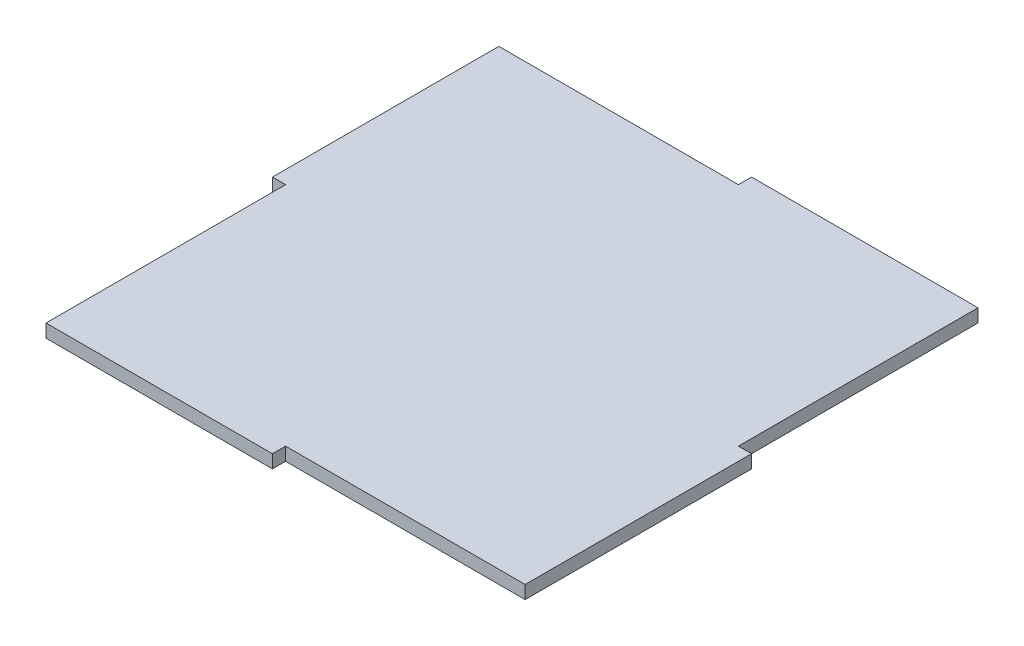
ISO-10303-21;
HEADER;
FILE_DESCRIPTION(('STEP AP214'),'2;1');
FILE_NAME('part.step','',(''),(''),'','','');
FILE_SCHEMA(('AUTOMOTIVE_DESIGN { 1 0 10303 214 1 1 1 1 }'));
ENDSEC;
DATA;
#1=APPLICATION_CONTEXT('core data for automotive mechanical design processes');
#2=APPLICATION_PROTOCOL_DEFINITION('international standard','automotive_design',2000,#1);
#3=PRODUCT_CONTEXT('',#1,'mechanical');
#4=PRODUCT('Part','Part','',(#3));
#5=PRODUCT_RELATED_PRODUCT_CATEGORY('part','',(#4));
#6=PRODUCT_DEFINITION_FORMATION('','',#4);
#7=PRODUCT_DEFINITION_CONTEXT('part definition',#1,'design');
#8=PRODUCT_DEFINITION('design','',#6,#7);
#9=PRODUCT_DEFINITION_SHAPE('','',#8);
#10=(LENGTH_UNIT() NAMED_UNIT(*) SI_UNIT(.MILLI.,.METRE.));
#11=(NAMED_UNIT(*) PLANE_ANGLE_UNIT() SI_UNIT($,.RADIAN.));
#12=(NAMED_UNIT(*) SI_UNIT($,.STERADIAN.) SOLID_ANGLE_UNIT());
#13=UNCERTAINTY_MEASURE_WITH_UNIT(LENGTH_MEASURE(1.E-05),#10,'distance_accuracy_value','');
#14=(GEOMETRIC_REPRESENTATION_CONTEXT(3) GLOBAL_UNCERTAINTY_ASSIGNED_CONTEXT((#13)) GLOBAL_UNIT_ASSIGNED_CONTEXT((#10,
#11,#12)) REPRESENTATION_CONTEXT('',''));
#15=CARTESIAN_POINT('',(0.,0.,0.));
#16=DIRECTION('',(0.,0.,1.));
#17=DIRECTION('',(1.,0.,0.));
#18=AXIS2_PLACEMENT_3D('',#15,#16,#17);
#19=CARTESIAN_POINT('',(41.3000000000002,2.4,-1.19406799263071E-13));
#20=DIRECTION('',(1.,0.,0.));
#21=DIRECTION('',(0.,0.,-1.));
#22=AXIS2_PLACEMENT_3D('',#19,#20,#21);
#23=PLANE('',#22);
#24=DIRECTION('',(0.,0.,1.));
#25=VECTOR('',#24,1.);
#26=CARTESIAN_POINT('',(41.3000000000002,0.,-1.19406799263071E-13));
#27=LINE('',#26,#25);
#28=CARTESIAN_POINT('',(41.3,0.,-87.4));
#29=VERTEX_POINT('',#28);
#30=CARTESIAN_POINT('',(41.3,0.,-85.));
#31=VERTEX_POINT('',#30);
#32=EDGE_CURVE('E155',#29,#31,#27,.T.);
#33=ORIENTED_EDGE('',*,*,#32,.T.);
#34=DIRECTION('',(0.,-1.,0.));
#35=VECTOR('',#34,1.);
#36=CARTESIAN_POINT('',(41.3,2.4,-85.));
#37=LINE('',#36,#35);
#38=CARTESIAN_POINT('',(41.3,2.4,-85.));
#39=VERTEX_POINT('',#38);
#40=EDGE_CURVE('E11',#39,#31,#37,.T.);
#41=ORIENTED_EDGE('',*,*,#40,.F.);
#42=DIRECTION('',(0.,0.,1.));
#43=VECTOR('',#42,1.);
#44=CARTESIAN_POINT('',(41.3000000000002,2.4,-1.19406799263071E-13));
#45=LINE('',#44,#43);
#46=CARTESIAN_POINT('',(41.3,2.4,-87.4));
#47=VERTEX_POINT('',#46);
#48=EDGE_CURVE('E181',#47,#39,#45,.T.);
#49=ORIENTED_EDGE('',*,*,#48,.F.);
#50=DIRECTION('',(0.,-1.,0.));
#51=VECTOR('',#50,1.);
#52=CARTESIAN_POINT('',(41.3,2.4,-87.4));
#53=LINE('',#52,#51);
#54=EDGE_CURVE('E51',#47,#29,#53,.T.);
#55=ORIENTED_EDGE('',*,*,#54,.T.);
#56=EDGE_LOOP('',(#33,#41,#49,#55));
#57=FACE_BOUND('',#56,.T.);
#58=ADVANCED_FACE('F35',(#57),#23,.F.);
#59=CARTESIAN_POINT('',(0.,2.4,-85.));
#60=DIRECTION('',(0.,0.,1.));
#61=DIRECTION('',(1.,0.,0.));
#62=AXIS2_PLACEMENT_3D('',#59,#60,#61);
#63=PLANE('',#62);
#64=DIRECTION('',(-1.,0.,0.));
#65=VECTOR('',#64,1.);
#66=CARTESIAN_POINT('',(0.,0.,-85.));
#67=LINE('',#66,#65);
#68=CARTESIAN_POINT('',(-2.40000000000001,0.,-85.));
#69=VERTEX_POINT('',#68);
#70=EDGE_CURVE('E157',#31,#69,#67,.T.);
#71=ORIENTED_EDGE('',*,*,#70,.T.);
#72=DIRECTION('',(0.,-1.,0.));
#73=VECTOR('',#72,1.);
#74=CARTESIAN_POINT('',(-2.40000000000001,2.4,-85.));
#75=LINE('',#74,#73);
#76=CARTESIAN_POINT('',(-2.40000000000001,2.4,-85.));
#77=VERTEX_POINT('',#76);
#78=EDGE_CURVE('E43',#77,#69,#75,.T.);
#79=ORIENTED_EDGE('',*,*,#78,.F.);
#80=DIRECTION('',(-1.,0.,0.));
#81=VECTOR('',#80,1.);
#82=CARTESIAN_POINT('',(0.,2.4,-85.));
#83=LINE('',#82,#81);
#84=EDGE_CURVE('E102',#39,#77,#83,.T.);
#85=ORIENTED_EDGE('',*,*,#84,.F.);
#86=ORIENTED_EDGE('',*,*,#40,.T.);
#87=EDGE_LOOP('',(#71,#79,#85,#86));
#88=FACE_BOUND('',#87,.T.);
#89=ADVANCED_FACE('F249',(#88),#63,.F.);
#90=CARTESIAN_POINT('',(-2.39999999999999,2.4,0.));
#91=DIRECTION('',(1.,0.,0.));
#92=DIRECTION('',(0.,0.,-1.));
#93=AXIS2_PLACEMENT_3D('',#90,#91,#92);
#94=PLANE('',#93);
#95=DIRECTION('',(0.,0.,1.));
#96=VECTOR('',#95,1.);
#97=CARTESIAN_POINT('',(-2.39999999999999,0.,0.));
#98=LINE('',#97,#96);
#99=CARTESIAN_POINT('',(-2.4,0.,-43.7));
#100=VERTEX_POINT('',#99);
#101=EDGE_CURVE('E159',#69,#100,#98,.T.);
#102=ORIENTED_EDGE('',*,*,#101,.T.);
#103=DIRECTION('',(0.,-1.,0.));
#104=VECTOR('',#103,1.);
#105=CARTESIAN_POINT('',(-2.4,2.4,-43.7));
#106=LINE('',#105,#104);
#107=CARTESIAN_POINT('',(-2.4,2.4,-43.7));
#108=VERTEX_POINT('',#107);
#109=EDGE_CURVE('E199',#108,#100,#106,.T.);
#110=ORIENTED_EDGE('',*,*,#109,.F.);
#111=DIRECTION('',(0.,0.,1.));
#112=VECTOR('',#111,1.);
#113=CARTESIAN_POINT('',(-2.39999999999999,2.4,0.));
#114=LINE('',#113,#112);
#115=EDGE_CURVE('E207',#77,#108,#114,.T.);
#116=ORIENTED_EDGE('',*,*,#115,.F.);
#117=ORIENTED_EDGE('',*,*,#78,.T.);
#118=EDGE_LOOP('',(#102,#110,#116,#117));
#119=FACE_BOUND('',#118,.T.);
#120=ADVANCED_FACE('F205',(#119),#94,.F.);
#121=CARTESIAN_POINT('',(0.,2.4,-43.7));
#122=DIRECTION('',(0.,0.,-1.));
#123=DIRECTION('',(-1.,0.,0.));
#124=AXIS2_PLACEMENT_3D('',#121,#122,#123);
#125=PLANE('',#124);
#126=DIRECTION('',(1.,0.,0.));
#127=VECTOR('',#126,1.);
#128=CARTESIAN_POINT('',(0.,0.,-43.7));
#129=LINE('',#128,#127);
#130=CARTESIAN_POINT('',(0.,0.,-43.7));
#131=VERTEX_POINT('',#130);
#132=EDGE_CURVE('E161',#100,#131,#129,.T.);
#133=ORIENTED_EDGE('',*,*,#132,.T.);
#134=DIRECTION('',(0.,-1.,0.));
#135=VECTOR('',#134,1.);
#136=CARTESIAN_POINT('',(0.,2.4,-43.7));
#137=LINE('',#136,#135);
#138=CARTESIAN_POINT('',(0.,2.4,-43.7));
#139=VERTEX_POINT('',#138);
#140=EDGE_CURVE('E196',#139,#131,#137,.T.);
#141=ORIENTED_EDGE('',*,*,#140,.F.);
#142=DIRECTION('',(1.,0.,0.));
#143=VECTOR('',#142,1.);
#144=CARTESIAN_POINT('',(0.,2.4,-43.7));
#145=LINE('',#144,#143);
#146=EDGE_CURVE('E224',#108,#139,#145,.T.);
#147=ORIENTED_EDGE('',*,*,#146,.F.);
#148=ORIENTED_EDGE('',*,*,#109,.T.);
#149=EDGE_LOOP('',(#133,#141,#147,#148));
#150=FACE_BOUND('',#149,.T.);
#151=ADVANCED_FACE('F215',(#150),#125,.F.);
#152=CARTESIAN_POINT('',(0.,2.4,0.));
#153=DIRECTION('',(1.,0.,0.));
#154=DIRECTION('',(0.,0.,-1.));
#155=AXIS2_PLACEMENT_3D('',#152,#153,#154);
#156=PLANE('',#155);
#157=DIRECTION('',(0.,0.,1.));
#158=VECTOR('',#157,1.);
#159=CARTESIAN_POINT('',(0.,0.,0.));
#160=LINE('',#159,#158);
#161=CARTESIAN_POINT('',(0.,0.,0.));
#162=VERTEX_POINT('',#161);
#163=EDGE_CURVE('E163',#131,#162,#160,.T.);
#164=ORIENTED_EDGE('',*,*,#163,.T.);
#165=DIRECTION('',(0.,-1.,0.));
#166=VECTOR('',#165,1.);
#167=CARTESIAN_POINT('',(0.,2.4,0.));
#168=LINE('',#167,#166);
#169=CARTESIAN_POINT('',(0.,2.4,0.));
#170=VERTEX_POINT('',#169);
#171=EDGE_CURVE('E193',#170,#162,#168,.T.);
#172=ORIENTED_EDGE('',*,*,#171,.F.);
#173=DIRECTION('',(0.,0.,1.));
#174=VECTOR('',#173,1.);
#175=CARTESIAN_POINT('',(0.,2.4,0.));
#176=LINE('',#175,#174);
#177=EDGE_CURVE('E221',#139,#170,#176,.T.);
#178=ORIENTED_EDGE('',*,*,#177,.F.);
#179=ORIENTED_EDGE('',*,*,#140,.T.);
#180=EDGE_LOOP('',(#164,#172,#178,#179));
#181=FACE_BOUND('',#180,.T.);
#182=ADVANCED_FACE('F219',(#181),#156,.F.);
#183=CARTESIAN_POINT('',(0.,2.4,0.));
#184=DIRECTION('',(0.,0.,-1.));
#185=DIRECTION('',(-1.,0.,0.));
#186=AXIS2_PLACEMENT_3D('',#183,#184,#185);
#187=PLANE('',#186);
#188=DIRECTION('',(1.,0.,0.));
#189=VECTOR('',#188,1.);
#190=CARTESIAN_POINT('',(0.,0.,0.));
#191=LINE('',#190,#189);
#192=CARTESIAN_POINT('',(41.3,0.,0.));
#193=VERTEX_POINT('',#192);
#194=EDGE_CURVE('E165',#162,#193,#191,.T.);
#195=ORIENTED_EDGE('',*,*,#194,.T.);
#196=DIRECTION('',(0.,-1.,0.));
#197=VECTOR('',#196,1.);
#198=CARTESIAN_POINT('',(41.3,2.4,0.));
#199=LINE('',#198,#197);
#200=CARTESIAN_POINT('',(41.3,2.4,0.));
#201=VERTEX_POINT('',#200);
#202=EDGE_CURVE('E190',#201,#193,#199,.T.);
#203=ORIENTED_EDGE('',*,*,#202,.F.);
#204=DIRECTION('',(1.,0.,0.));
#205=VECTOR('',#204,1.);
#206=CARTESIAN_POINT('',(0.,2.4,0.));
#207=LINE('',#206,#205);
#208=EDGE_CURVE('E223',#170,#201,#207,.T.);
#209=ORIENTED_EDGE('',*,*,#208,.F.);
#210=ORIENTED_EDGE('',*,*,#171,.T.);
#211=EDGE_LOOP('',(#195,#203,#209,#210));
#212=FACE_BOUND('',#211,.T.);
#213=ADVANCED_FACE('F265',(#212),#187,.F.);
#214=CARTESIAN_POINT('',(41.3,2.4,0.));
#215=DIRECTION('',(-1.,0.,0.));
#216=DIRECTION('',(0.,0.,1.));
#217=AXIS2_PLACEMENT_3D('',#214,#215,#216);
#218=PLANE('',#217);
#219=DIRECTION('',(0.,0.,-1.));
#220=VECTOR('',#219,1.);
#221=CARTESIAN_POINT('',(41.3,0.,0.));
#222=LINE('',#221,#220);
#223=CARTESIAN_POINT('',(41.3,0.,-2.4));
#224=VERTEX_POINT('',#223);
#225=EDGE_CURVE('E167',#193,#224,#222,.T.);
#226=ORIENTED_EDGE('',*,*,#225,.T.);
#227=DIRECTION('',(0.,-1.,0.));
#228=VECTOR('',#227,1.);
#229=CARTESIAN_POINT('',(41.3,2.4,-2.4));
#230=LINE('',#229,#228);
#231=CARTESIAN_POINT('',(41.3,2.4,-2.4));
#232=VERTEX_POINT('',#231);
#233=EDGE_CURVE('E187',#232,#224,#230,.T.);
#234=ORIENTED_EDGE('',*,*,#233,.F.);
#235=DIRECTION('',(0.,0.,-1.));
#236=VECTOR('',#235,1.);
#237=CARTESIAN_POINT('',(41.3,2.4,0.));
#238=LINE('',#237,#236);
#239=EDGE_CURVE('E226',#201,#232,#238,.T.);
#240=ORIENTED_EDGE('',*,*,#239,.F.);
#241=ORIENTED_EDGE('',*,*,#202,.T.);
#242=EDGE_LOOP('',(#226,#234,#240,#241));
#243=FACE_BOUND('',#242,.T.);
#244=ADVANCED_FACE('F268',(#243),#218,.F.);
#245=CARTESIAN_POINT('',(0.,2.4,-2.4));
#246=DIRECTION('',(0.,0.,-1.));
#247=DIRECTION('',(-1.,0.,0.));
#248=AXIS2_PLACEMENT_3D('',#245,#246,#247);
#249=PLANE('',#248);
#250=DIRECTION('',(1.,0.,0.));
#251=VECTOR('',#250,1.);
#252=CARTESIAN_POINT('',(0.,0.,-2.4));
#253=LINE('',#252,#251);
#254=CARTESIAN_POINT('',(85.,0.,-2.4));
#255=VERTEX_POINT('',#254);
#256=EDGE_CURVE('E169',#224,#255,#253,.T.);
#257=ORIENTED_EDGE('',*,*,#256,.T.);
#258=DIRECTION('',(0.,-1.,0.));
#259=VECTOR('',#258,1.);
#260=CARTESIAN_POINT('',(85.,2.4,-2.4));
#261=LINE('',#260,#259);
#262=CARTESIAN_POINT('',(85.,2.4,-2.4));
#263=VERTEX_POINT('',#262);
#264=EDGE_CURVE('E185',#263,#255,#261,.T.);
#265=ORIENTED_EDGE('',*,*,#264,.F.);
#266=DIRECTION('',(1.,0.,0.));
#267=VECTOR('',#266,1.);
#268=CARTESIAN_POINT('',(0.,2.4,-2.4));
#269=LINE('',#268,#267);
#270=EDGE_CURVE('E232',#232,#263,#269,.T.);
#271=ORIENTED_EDGE('',*,*,#270,.F.);
#272=ORIENTED_EDGE('',*,*,#233,.T.);
#273=EDGE_LOOP('',(#257,#265,#271,#272));
#274=FACE_BOUND('',#273,.T.);
#275=ADVANCED_FACE('F272',(#274),#249,.F.);
#276=CARTESIAN_POINT('',(85.,2.4,0.));
#277=DIRECTION('',(1.,0.,0.));
#278=DIRECTION('',(0.,0.,-1.));
#279=AXIS2_PLACEMENT_3D('',#276,#277,#278);
#280=PLANE('',#279);
#281=DIRECTION('',(0.,0.,1.));
#282=VECTOR('',#281,1.);
#283=CARTESIAN_POINT('',(85.,0.,0.));
#284=LINE('',#283,#282);
#285=CARTESIAN_POINT('',(85.,0.,-43.7));
#286=VERTEX_POINT('',#285);
#287=EDGE_CURVE('E172',#286,#255,#284,.T.);
#288=ORIENTED_EDGE('',*,*,#287,.F.);
#289=DIRECTION('',(0.,-1.,0.));
#290=VECTOR('',#289,1.);
#291=CARTESIAN_POINT('',(85.,2.4,-43.7));
#292=LINE('',#291,#290);
#293=CARTESIAN_POINT('',(85.,2.4,-43.7));
#294=VERTEX_POINT('',#293);
#295=EDGE_CURVE('E147',#294,#286,#292,.T.);
#296=ORIENTED_EDGE('',*,*,#295,.F.);
#297=DIRECTION('',(0.,0.,1.));
#298=VECTOR('',#297,1.);
#299=CARTESIAN_POINT('',(85.,2.4,0.));
#300=LINE('',#299,#298);
#301=EDGE_CURVE('E137',#294,#263,#300,.T.);
#302=ORIENTED_EDGE('',*,*,#301,.T.);
#303=ORIENTED_EDGE('',*,*,#264,.T.);
#304=EDGE_LOOP('',(#288,#296,#302,#303));
#305=FACE_BOUND('',#304,.T.);
#306=ADVANCED_FACE('F235',(#305),#280,.T.);
#307=CARTESIAN_POINT('',(-2.52691386333952E-13,2.4,-43.6999999999995));
#308=DIRECTION('',(0.,0.,1.));
#309=DIRECTION('',(1.,0.,0.));
#310=AXIS2_PLACEMENT_3D('',#307,#308,#309);
#311=PLANE('',#310);
#312=DIRECTION('',(-1.,0.,0.));
#313=VECTOR('',#312,1.);
#314=CARTESIAN_POINT('',(-2.52691386333952E-13,0.,-43.6999999999995));
#315=LINE('',#314,#313);
#316=CARTESIAN_POINT('',(82.6,0.,-43.7));
#317=VERTEX_POINT('',#316);
#318=EDGE_CURVE('E144',#286,#317,#315,.T.);
#319=ORIENTED_EDGE('',*,*,#318,.T.);
#320=DIRECTION('',(0.,-1.,0.));
#321=VECTOR('',#320,1.);
#322=CARTESIAN_POINT('',(82.6,2.4,-43.7));
#323=LINE('',#322,#321);
#324=CARTESIAN_POINT('',(82.6,2.4,-43.7));
#325=VERTEX_POINT('',#324);
#326=EDGE_CURVE('E141',#325,#317,#323,.T.);
#327=ORIENTED_EDGE('',*,*,#326,.F.);
#328=DIRECTION('',(-1.,0.,0.));
#329=VECTOR('',#328,1.);
#330=CARTESIAN_POINT('',(-2.52691386333952E-13,2.4,-43.6999999999995));
#331=LINE('',#330,#329);
#332=EDGE_CURVE('E130',#294,#325,#331,.T.);
#333=ORIENTED_EDGE('',*,*,#332,.F.);
#334=ORIENTED_EDGE('',*,*,#295,.T.);
#335=EDGE_LOOP('',(#319,#327,#333,#334));
#336=FACE_BOUND('',#335,.T.);
#337=ADVANCED_FACE('F142',(#336),#311,.F.);
#338=CARTESIAN_POINT('',(82.6,2.4,0.));
#339=DIRECTION('',(-1.,0.,0.));
#340=DIRECTION('',(0.,0.,1.));
#341=AXIS2_PLACEMENT_3D('',#338,#339,#340);
#342=PLANE('',#341);
#343=DIRECTION('',(0.,0.,-1.));
#344=VECTOR('',#343,1.);
#345=CARTESIAN_POINT('',(82.6,0.,0.));
#346=LINE('',#345,#344);
#347=CARTESIAN_POINT('',(82.6,0.,-87.4));
#348=VERTEX_POINT('',#347);
#349=EDGE_CURVE('E176',#317,#348,#346,.T.);
#350=ORIENTED_EDGE('',*,*,#349,.T.);
#351=DIRECTION('',(0.,-1.,0.));
#352=VECTOR('',#351,1.);
#353=CARTESIAN_POINT('',(82.6,2.4,-87.4));
#354=LINE('',#353,#352);
#355=CARTESIAN_POINT('',(82.6,2.4,-87.4));
#356=VERTEX_POINT('',#355);
#357=EDGE_CURVE('E90',#356,#348,#354,.T.);
#358=ORIENTED_EDGE('',*,*,#357,.F.);
#359=DIRECTION('',(0.,0.,-1.));
#360=VECTOR('',#359,1.);
#361=CARTESIAN_POINT('',(82.6,2.4,0.));
#362=LINE('',#361,#360);
#363=EDGE_CURVE('E135',#325,#356,#362,.T.);
#364=ORIENTED_EDGE('',*,*,#363,.F.);
#365=ORIENTED_EDGE('',*,*,#326,.T.);
#366=EDGE_LOOP('',(#350,#358,#364,#365));
#367=FACE_BOUND('',#366,.T.);
#368=ADVANCED_FACE('F149',(#367),#342,.F.);
#369=CARTESIAN_POINT('',(0.,2.4,-87.4));
#370=DIRECTION('',(0.,0.,-1.));
#371=DIRECTION('',(-1.,0.,0.));
#372=AXIS2_PLACEMENT_3D('',#369,#370,#371);
#373=PLANE('',#372);
#374=DIRECTION('',(1.,0.,0.));
#375=VECTOR('',#374,1.);
#376=CARTESIAN_POINT('',(0.,0.,-87.4));
#377=LINE('',#376,#375);
#378=EDGE_CURVE('E178',#29,#348,#377,.T.);
#379=ORIENTED_EDGE('',*,*,#378,.F.);
#380=ORIENTED_EDGE('',*,*,#54,.F.);
#381=DIRECTION('',(1.,0.,0.));
#382=VECTOR('',#381,1.);
#383=CARTESIAN_POINT('',(0.,2.4,-87.4));
#384=LINE('',#383,#382);
#385=EDGE_CURVE('E150',#47,#356,#384,.T.);
#386=ORIENTED_EDGE('',*,*,#385,.T.);
#387=ORIENTED_EDGE('',*,*,#357,.T.);
#388=EDGE_LOOP('',(#379,#380,#386,#387));
#389=FACE_BOUND('',#388,.T.);
#390=ADVANCED_FACE('F238',(#389),#373,.T.);
#391=CARTESIAN_POINT('',(0.,2.4,0.));
#392=DIRECTION('',(0.,1.,0.));
#393=DIRECTION('',(0.,0.,1.));
#394=AXIS2_PLACEMENT_3D('',#391,#392,#393);
#395=PLANE('',#394);
#396=ORIENTED_EDGE('',*,*,#48,.T.);
#397=ORIENTED_EDGE('',*,*,#84,.T.);
#398=ORIENTED_EDGE('',*,*,#115,.T.);
#399=ORIENTED_EDGE('',*,*,#146,.T.);
#400=ORIENTED_EDGE('',*,*,#177,.T.);
#401=ORIENTED_EDGE('',*,*,#208,.T.);
#402=ORIENTED_EDGE('',*,*,#239,.T.);
#403=ORIENTED_EDGE('',*,*,#270,.T.);
#404=ORIENTED_EDGE('',*,*,#301,.F.);
#405=ORIENTED_EDGE('',*,*,#332,.T.);
#406=ORIENTED_EDGE('',*,*,#363,.T.);
#407=ORIENTED_EDGE('',*,*,#385,.F.);
#408=EDGE_LOOP('',(#396,#397,#398,#399,#400,#401,#402,#403,#404,#405,#406,#407));
#409=FACE_BOUND('',#408,.T.);
#410=ADVANCED_FACE('F132',(#409),#395,.T.);
#411=CARTESIAN_POINT('',(0.,0.,0.));
#412=DIRECTION('',(0.,1.,0.));
#413=DIRECTION('',(0.,0.,1.));
#414=AXIS2_PLACEMENT_3D('',#411,#412,#413);
#415=PLANE('',#414);
#416=ORIENTED_EDGE('',*,*,#32,.F.);
#417=ORIENTED_EDGE('',*,*,#378,.T.);
#418=ORIENTED_EDGE('',*,*,#349,.F.);
#419=ORIENTED_EDGE('',*,*,#318,.F.);
#420=ORIENTED_EDGE('',*,*,#287,.T.);
#421=ORIENTED_EDGE('',*,*,#256,.F.);
#422=ORIENTED_EDGE('',*,*,#225,.F.);
#423=ORIENTED_EDGE('',*,*,#194,.F.);
#424=ORIENTED_EDGE('',*,*,#163,.F.);
#425=ORIENTED_EDGE('',*,*,#132,.F.);
#426=ORIENTED_EDGE('',*,*,#101,.F.);
#427=ORIENTED_EDGE('',*,*,#70,.F.);
#428=EDGE_LOOP('',(#416,#417,#418,#419,#420,#421,#422,#423,#424,#425,#426,#427));
#429=FACE_BOUND('',#428,.T.);
#430=ADVANCED_FACE('F210',(#429),#415,.F.);
#431=CLOSED_SHELL('',(#58,#89,#120,#151,#182,#213,#244,#275,#306,#337,#368,#390,#410,#430));
#432=MANIFOLD_SOLID_BREP('B2',#431);
#433=ADVANCED_BREP_SHAPE_REPRESENTATION('',(#18,#432),#14);
#434=SHAPE_DEFINITION_REPRESENTATION(#9,#433);
ENDSEC;
END-ISO-10303-21;
